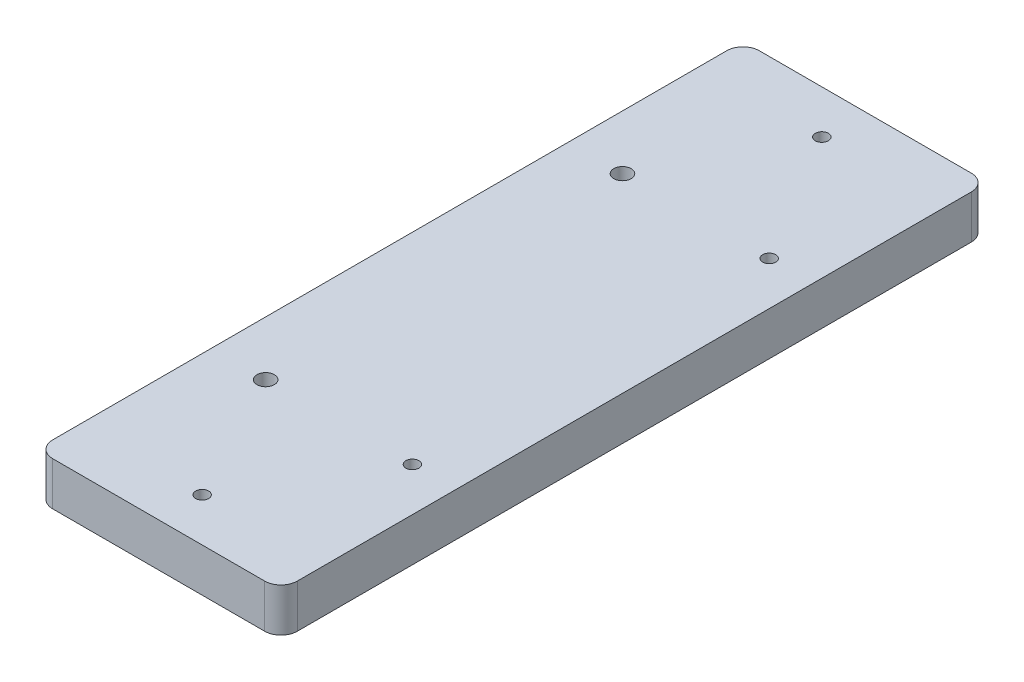
ISO-10303-21;
HEADER;
FILE_DESCRIPTION(('STEP AP214'),'2;1');
FILE_NAME('part.step','',(''),(''),'','','');
FILE_SCHEMA(('AUTOMOTIVE_DESIGN { 1 0 10303 214 1 1 1 1 }'));
ENDSEC;
DATA;
#1=APPLICATION_CONTEXT('core data for automotive mechanical design processes');
#2=APPLICATION_PROTOCOL_DEFINITION('international standard','automotive_design',2000,#1);
#3=PRODUCT_CONTEXT('',#1,'mechanical');
#4=PRODUCT('Part','Part','',(#3));
#5=PRODUCT_RELATED_PRODUCT_CATEGORY('part','',(#4));
#6=PRODUCT_DEFINITION_FORMATION('','',#4);
#7=PRODUCT_DEFINITION_CONTEXT('part definition',#1,'design');
#8=PRODUCT_DEFINITION('design','',#6,#7);
#9=PRODUCT_DEFINITION_SHAPE('','',#8);
#10=(LENGTH_UNIT() NAMED_UNIT(*) SI_UNIT(.MILLI.,.METRE.));
#11=(NAMED_UNIT(*) PLANE_ANGLE_UNIT() SI_UNIT($,.RADIAN.));
#12=(NAMED_UNIT(*) SI_UNIT($,.STERADIAN.) SOLID_ANGLE_UNIT());
#13=UNCERTAINTY_MEASURE_WITH_UNIT(LENGTH_MEASURE(1.E-05),#10,'distance_accuracy_value','');
#14=(GEOMETRIC_REPRESENTATION_CONTEXT(3) GLOBAL_UNCERTAINTY_ASSIGNED_CONTEXT((#13)) GLOBAL_UNIT_ASSIGNED_CONTEXT((#10,
#11,#12)) REPRESENTATION_CONTEXT('',''));
#15=CARTESIAN_POINT('',(0.,0.,0.));
#16=DIRECTION('',(0.,0.,1.));
#17=DIRECTION('',(1.,0.,0.));
#18=AXIS2_PLACEMENT_3D('',#15,#16,#17);
#19=CARTESIAN_POINT('',(0.,8.,0.));
#20=DIRECTION('',(0.,-1.,0.));
#21=DIRECTION('',(0.,0.,-1.));
#22=AXIS2_PLACEMENT_3D('',#19,#20,#21);
#23=PLANE('',#22);
#24=DIRECTION('',(-1.,0.,0.));
#25=VECTOR('',#24,1.);
#26=CARTESIAN_POINT('',(0.,8.,-130.));
#27=LINE('',#26,#25);
#28=CARTESIAN_POINT('',(42.,8.,-130.));
#29=VERTEX_POINT('',#28);
#30=CARTESIAN_POINT('',(3.,8.,-130.));
#31=VERTEX_POINT('',#30);
#32=EDGE_CURVE('E175',#29,#31,#27,.T.);
#33=ORIENTED_EDGE('',*,*,#32,.T.);
#34=CARTESIAN_POINT('',(3.,8.,-127.));
#35=DIRECTION('',(0.,-1.,0.));
#36=DIRECTION('',(0.,0.,-1.));
#37=AXIS2_PLACEMENT_3D('',#34,#35,#36);
#38=CIRCLE('',#37,3.);
#39=CARTESIAN_POINT('',(0.,8.,-127.));
#40=VERTEX_POINT('',#39);
#41=EDGE_CURVE('E152',#31,#40,#38,.F.);
#42=ORIENTED_EDGE('',*,*,#41,.T.);
#43=DIRECTION('',(0.,0.,1.));
#44=VECTOR('',#43,1.);
#45=CARTESIAN_POINT('',(0.,8.,0.));
#46=LINE('',#45,#44);
#47=CARTESIAN_POINT('',(0.,8.,-3.));
#48=VERTEX_POINT('',#47);
#49=EDGE_CURVE('E123',#40,#48,#46,.T.);
#50=ORIENTED_EDGE('',*,*,#49,.T.);
#51=CARTESIAN_POINT('',(3.,8.,-3.));
#52=DIRECTION('',(0.,-1.,0.));
#53=DIRECTION('',(0.,0.,-1.));
#54=AXIS2_PLACEMENT_3D('',#51,#52,#53);
#55=CIRCLE('',#54,3.);
#56=CARTESIAN_POINT('',(3.,8.,0.));
#57=VERTEX_POINT('',#56);
#58=EDGE_CURVE('E147',#48,#57,#55,.F.);
#59=ORIENTED_EDGE('',*,*,#58,.T.);
#60=DIRECTION('',(1.,0.,0.));
#61=VECTOR('',#60,1.);
#62=CARTESIAN_POINT('',(45.,8.,0.));
#63=LINE('',#62,#61);
#64=CARTESIAN_POINT('',(42.,8.,0.));
#65=VERTEX_POINT('',#64);
#66=EDGE_CURVE('E130',#57,#65,#63,.T.);
#67=ORIENTED_EDGE('',*,*,#66,.T.);
#68=CARTESIAN_POINT('',(42.,8.,-3.));
#69=DIRECTION('',(0.,-1.,0.));
#70=DIRECTION('',(0.,0.,-1.));
#71=AXIS2_PLACEMENT_3D('',#68,#69,#70);
#72=CIRCLE('',#71,3.);
#73=CARTESIAN_POINT('',(45.,8.,-3.));
#74=VERTEX_POINT('',#73);
#75=EDGE_CURVE('E59',#65,#74,#72,.F.);
#76=ORIENTED_EDGE('',*,*,#75,.T.);
#77=DIRECTION('',(0.,0.,-1.));
#78=VECTOR('',#77,1.);
#79=CARTESIAN_POINT('',(45.,8.,-130.));
#80=LINE('',#79,#78);
#81=CARTESIAN_POINT('',(45.,8.,-127.));
#82=VERTEX_POINT('',#81);
#83=EDGE_CURVE('E133',#74,#82,#80,.T.);
#84=ORIENTED_EDGE('',*,*,#83,.T.);
#85=CARTESIAN_POINT('',(42.,8.,-127.));
#86=DIRECTION('',(0.,-1.,0.));
#87=DIRECTION('',(0.,0.,-1.));
#88=AXIS2_PLACEMENT_3D('',#85,#86,#87);
#89=CIRCLE('',#88,3.);
#90=EDGE_CURVE('E150',#82,#29,#89,.F.);
#91=ORIENTED_EDGE('',*,*,#90,.T.);
#92=EDGE_LOOP('',(#33,#42,#50,#59,#67,#76,#84,#91));
#93=FACE_BOUND('',#92,.T.);
#94=CARTESIAN_POINT('',(10.,8.,-32.175));
#95=DIRECTION('',(0.,1.,0.));
#96=DIRECTION('',(0.,0.,1.));
#97=AXIS2_PLACEMENT_3D('',#94,#95,#96);
#98=CIRCLE('',#97,1.6);
#99=CARTESIAN_POINT('',(10.,8.,-30.575));
#100=VERTEX_POINT('',#99);
#101=EDGE_CURVE('E168',#100,#100,#98,.T.);
#102=ORIENTED_EDGE('',*,*,#101,.F.);
#103=EDGE_LOOP('',(#102));
#104=FACE_BOUND('',#103,.T.);
#105=CARTESIAN_POINT('',(10.,8.,-97.825));
#106=DIRECTION('',(0.,1.,0.));
#107=DIRECTION('',(0.,0.,1.));
#108=AXIS2_PLACEMENT_3D('',#105,#106,#107);
#109=CIRCLE('',#108,1.6);
#110=CARTESIAN_POINT('',(10.,8.,-96.225));
#111=VERTEX_POINT('',#110);
#112=EDGE_CURVE('E180',#111,#111,#109,.T.);
#113=ORIENTED_EDGE('',*,*,#112,.F.);
#114=EDGE_LOOP('',(#113));
#115=FACE_BOUND('',#114,.T.);
#116=CARTESIAN_POINT('',(22.5,8.,-8.));
#117=DIRECTION('',(0.,1.,0.));
#118=DIRECTION('',(0.,0.,1.));
#119=AXIS2_PLACEMENT_3D('',#116,#117,#118);
#120=CIRCLE('',#119,1.2);
#121=CARTESIAN_POINT('',(22.5,8.,-6.8));
#122=VERTEX_POINT('',#121);
#123=EDGE_CURVE('E185',#122,#122,#120,.T.);
#124=ORIENTED_EDGE('',*,*,#123,.F.);
#125=EDGE_LOOP('',(#124));
#126=FACE_BOUND('',#125,.T.);
#127=CARTESIAN_POINT('',(22.5,8.,-122.));
#128=DIRECTION('',(0.,1.,0.));
#129=DIRECTION('',(0.,0.,1.));
#130=AXIS2_PLACEMENT_3D('',#127,#128,#129);
#131=CIRCLE('',#130,1.20000000000001);
#132=CARTESIAN_POINT('',(22.5,8.,-120.8));
#133=VERTEX_POINT('',#132);
#134=EDGE_CURVE('E191',#133,#133,#131,.T.);
#135=ORIENTED_EDGE('',*,*,#134,.F.);
#136=EDGE_LOOP('',(#135));
#137=FACE_BOUND('',#136,.T.);
#138=CARTESIAN_POINT('',(37.,8.,-97.825));
#139=DIRECTION('',(0.,1.,0.));
#140=DIRECTION('',(0.,0.,1.));
#141=AXIS2_PLACEMENT_3D('',#138,#139,#140);
#142=CIRCLE('',#141,1.2);
#143=CARTESIAN_POINT('',(37.,8.,-96.625));
#144=VERTEX_POINT('',#143);
#145=EDGE_CURVE('E197',#144,#144,#142,.T.);
#146=ORIENTED_EDGE('',*,*,#145,.F.);
#147=EDGE_LOOP('',(#146));
#148=FACE_BOUND('',#147,.T.);
#149=CARTESIAN_POINT('',(37.,8.,-32.175));
#150=DIRECTION('',(0.,1.,0.));
#151=DIRECTION('',(0.,0.,1.));
#152=AXIS2_PLACEMENT_3D('',#149,#150,#151);
#153=CIRCLE('',#152,1.2);
#154=CARTESIAN_POINT('',(37.,8.,-30.975));
#155=VERTEX_POINT('',#154);
#156=EDGE_CURVE('E203',#155,#155,#153,.T.);
#157=ORIENTED_EDGE('',*,*,#156,.F.);
#158=EDGE_LOOP('',(#157));
#159=FACE_BOUND('',#158,.T.);
#160=ADVANCED_FACE('F37',(#93,#104,#115,#126,#137,#148,#159),#23,.F.);
#161=CARTESIAN_POINT('',(0.,0.,0.));
#162=DIRECTION('',(0.,-1.,0.));
#163=DIRECTION('',(0.,0.,-1.));
#164=AXIS2_PLACEMENT_3D('',#161,#162,#163);
#165=PLANE('',#164);
#166=CARTESIAN_POINT('',(37.,0.,-97.825));
#167=DIRECTION('',(0.,1.,0.));
#168=DIRECTION('',(0.,0.,1.));
#169=AXIS2_PLACEMENT_3D('',#166,#167,#168);
#170=CIRCLE('',#169,1.2);
#171=CARTESIAN_POINT('',(37.,0.,-96.625));
#172=VERTEX_POINT('',#171);
#173=EDGE_CURVE('E200',#172,#172,#170,.T.);
#174=ORIENTED_EDGE('',*,*,#173,.T.);
#175=EDGE_LOOP('',(#174));
#176=FACE_BOUND('',#175,.T.);
#177=CARTESIAN_POINT('',(22.5,0.,-8.));
#178=DIRECTION('',(0.,1.,0.));
#179=DIRECTION('',(0.,0.,1.));
#180=AXIS2_PLACEMENT_3D('',#177,#178,#179);
#181=CIRCLE('',#180,1.2);
#182=CARTESIAN_POINT('',(22.5,0.,-6.8));
#183=VERTEX_POINT('',#182);
#184=EDGE_CURVE('E188',#183,#183,#181,.T.);
#185=ORIENTED_EDGE('',*,*,#184,.T.);
#186=EDGE_LOOP('',(#185));
#187=FACE_BOUND('',#186,.T.);
#188=CARTESIAN_POINT('',(10.,0.,-32.175));
#189=DIRECTION('',(0.,1.,0.));
#190=DIRECTION('',(0.,0.,1.));
#191=AXIS2_PLACEMENT_3D('',#188,#189,#190);
#192=CIRCLE('',#191,1.6);
#193=CARTESIAN_POINT('',(10.,0.,-30.575));
#194=VERTEX_POINT('',#193);
#195=EDGE_CURVE('E171',#194,#194,#192,.T.);
#196=ORIENTED_EDGE('',*,*,#195,.T.);
#197=EDGE_LOOP('',(#196));
#198=FACE_BOUND('',#197,.T.);
#199=DIRECTION('',(0.,0.,1.));
#200=VECTOR('',#199,1.);
#201=CARTESIAN_POINT('',(0.,0.,0.));
#202=LINE('',#201,#200);
#203=CARTESIAN_POINT('',(0.,0.,-127.));
#204=VERTEX_POINT('',#203);
#205=CARTESIAN_POINT('',(0.,0.,-3.));
#206=VERTEX_POINT('',#205);
#207=EDGE_CURVE('E120',#204,#206,#202,.T.);
#208=ORIENTED_EDGE('',*,*,#207,.F.);
#209=CARTESIAN_POINT('',(3.,0.,-127.));
#210=DIRECTION('',(0.,-1.,0.));
#211=DIRECTION('',(0.,0.,-1.));
#212=AXIS2_PLACEMENT_3D('',#209,#210,#211);
#213=CIRCLE('',#212,3.);
#214=CARTESIAN_POINT('',(3.,0.,-130.));
#215=VERTEX_POINT('',#214);
#216=EDGE_CURVE('E103',#204,#215,#213,.T.);
#217=ORIENTED_EDGE('',*,*,#216,.T.);
#218=DIRECTION('',(-1.,0.,0.));
#219=VECTOR('',#218,1.);
#220=CARTESIAN_POINT('',(0.,0.,-130.));
#221=LINE('',#220,#219);
#222=CARTESIAN_POINT('',(42.,0.,-130.));
#223=VERTEX_POINT('',#222);
#224=EDGE_CURVE('E131',#223,#215,#221,.T.);
#225=ORIENTED_EDGE('',*,*,#224,.F.);
#226=CARTESIAN_POINT('',(42.,0.,-127.));
#227=DIRECTION('',(0.,-1.,0.));
#228=DIRECTION('',(0.,0.,-1.));
#229=AXIS2_PLACEMENT_3D('',#226,#227,#228);
#230=CIRCLE('',#229,3.);
#231=CARTESIAN_POINT('',(45.,0.,-127.));
#232=VERTEX_POINT('',#231);
#233=EDGE_CURVE('E114',#223,#232,#230,.T.);
#234=ORIENTED_EDGE('',*,*,#233,.T.);
#235=DIRECTION('',(0.,0.,-1.));
#236=VECTOR('',#235,1.);
#237=CARTESIAN_POINT('',(45.,0.,-130.));
#238=LINE('',#237,#236);
#239=CARTESIAN_POINT('',(45.,0.,-3.));
#240=VERTEX_POINT('',#239);
#241=EDGE_CURVE('E135',#240,#232,#238,.T.);
#242=ORIENTED_EDGE('',*,*,#241,.F.);
#243=CARTESIAN_POINT('',(42.,0.,-3.));
#244=DIRECTION('',(0.,-1.,0.));
#245=DIRECTION('',(0.,0.,-1.));
#246=AXIS2_PLACEMENT_3D('',#243,#244,#245);
#247=CIRCLE('',#246,3.);
#248=CARTESIAN_POINT('',(42.,0.,0.));
#249=VERTEX_POINT('',#248);
#250=EDGE_CURVE('E141',#240,#249,#247,.T.);
#251=ORIENTED_EDGE('',*,*,#250,.T.);
#252=DIRECTION('',(1.,0.,0.));
#253=VECTOR('',#252,1.);
#254=CARTESIAN_POINT('',(45.,0.,0.));
#255=LINE('',#254,#253);
#256=CARTESIAN_POINT('',(3.,0.,0.));
#257=VERTEX_POINT('',#256);
#258=EDGE_CURVE('E163',#257,#249,#255,.T.);
#259=ORIENTED_EDGE('',*,*,#258,.F.);
#260=CARTESIAN_POINT('',(3.,0.,-3.));
#261=DIRECTION('',(0.,-1.,0.));
#262=DIRECTION('',(0.,0.,-1.));
#263=AXIS2_PLACEMENT_3D('',#260,#261,#262);
#264=CIRCLE('',#263,3.);
#265=EDGE_CURVE('E124',#257,#206,#264,.T.);
#266=ORIENTED_EDGE('',*,*,#265,.T.);
#267=EDGE_LOOP('',(#208,#217,#225,#234,#242,#251,#259,#266));
#268=FACE_BOUND('',#267,.T.);
#269=CARTESIAN_POINT('',(10.,0.,-97.825));
#270=DIRECTION('',(0.,1.,0.));
#271=DIRECTION('',(0.,0.,1.));
#272=AXIS2_PLACEMENT_3D('',#269,#270,#271);
#273=CIRCLE('',#272,1.6);
#274=CARTESIAN_POINT('',(10.,0.,-96.225));
#275=VERTEX_POINT('',#274);
#276=EDGE_CURVE('E182',#275,#275,#273,.T.);
#277=ORIENTED_EDGE('',*,*,#276,.T.);
#278=EDGE_LOOP('',(#277));
#279=FACE_BOUND('',#278,.T.);
#280=CARTESIAN_POINT('',(22.5,0.,-122.));
#281=DIRECTION('',(0.,1.,0.));
#282=DIRECTION('',(0.,0.,1.));
#283=AXIS2_PLACEMENT_3D('',#280,#281,#282);
#284=CIRCLE('',#283,1.20000000000001);
#285=CARTESIAN_POINT('',(22.5,0.,-120.8));
#286=VERTEX_POINT('',#285);
#287=EDGE_CURVE('E194',#286,#286,#284,.T.);
#288=ORIENTED_EDGE('',*,*,#287,.T.);
#289=EDGE_LOOP('',(#288));
#290=FACE_BOUND('',#289,.T.);
#291=CARTESIAN_POINT('',(37.,0.,-32.175));
#292=DIRECTION('',(0.,1.,0.));
#293=DIRECTION('',(0.,0.,1.));
#294=AXIS2_PLACEMENT_3D('',#291,#292,#293);
#295=CIRCLE('',#294,1.2);
#296=CARTESIAN_POINT('',(37.,0.,-30.975));
#297=VERTEX_POINT('',#296);
#298=EDGE_CURVE('E206',#297,#297,#295,.T.);
#299=ORIENTED_EDGE('',*,*,#298,.T.);
#300=EDGE_LOOP('',(#299));
#301=FACE_BOUND('',#300,.T.);
#302=ADVANCED_FACE('F127',(#176,#187,#198,#268,#279,#290,#301),#165,.T.);
#303=CARTESIAN_POINT('',(45.,8.,0.));
#304=DIRECTION('',(0.,0.,-1.));
#305=DIRECTION('',(-1.,0.,0.));
#306=AXIS2_PLACEMENT_3D('',#303,#304,#305);
#307=PLANE('',#306);
#308=ORIENTED_EDGE('',*,*,#258,.T.);
#309=DIRECTION('',(0.,-1.,0.));
#310=VECTOR('',#309,1.);
#311=CARTESIAN_POINT('',(42.,8.,0.));
#312=LINE('',#311,#310);
#313=EDGE_CURVE('E11',#249,#65,#312,.F.);
#314=ORIENTED_EDGE('',*,*,#313,.T.);
#315=ORIENTED_EDGE('',*,*,#66,.F.);
#316=DIRECTION('',(0.,-1.,0.));
#317=VECTOR('',#316,1.);
#318=CARTESIAN_POINT('',(3.,8.,0.));
#319=LINE('',#318,#317);
#320=EDGE_CURVE('E45',#57,#257,#319,.T.);
#321=ORIENTED_EDGE('',*,*,#320,.T.);
#322=EDGE_LOOP('',(#308,#314,#315,#321));
#323=FACE_BOUND('',#322,.T.);
#324=ADVANCED_FACE('F162',(#323),#307,.F.);
#325=CARTESIAN_POINT('',(45.,8.,-130.));
#326=DIRECTION('',(-1.,0.,0.));
#327=DIRECTION('',(0.,0.,1.));
#328=AXIS2_PLACEMENT_3D('',#325,#326,#327);
#329=PLANE('',#328);
#330=ORIENTED_EDGE('',*,*,#241,.T.);
#331=DIRECTION('',(0.,-1.,0.));
#332=VECTOR('',#331,1.);
#333=CARTESIAN_POINT('',(45.,8.,-127.));
#334=LINE('',#333,#332);
#335=EDGE_CURVE('E52',#232,#82,#334,.F.);
#336=ORIENTED_EDGE('',*,*,#335,.T.);
#337=ORIENTED_EDGE('',*,*,#83,.F.);
#338=DIRECTION('',(0.,-1.,0.));
#339=VECTOR('',#338,1.);
#340=CARTESIAN_POINT('',(45.,8.,-3.));
#341=LINE('',#340,#339);
#342=EDGE_CURVE('E154',#74,#240,#341,.T.);
#343=ORIENTED_EDGE('',*,*,#342,.T.);
#344=EDGE_LOOP('',(#330,#336,#337,#343));
#345=FACE_BOUND('',#344,.T.);
#346=ADVANCED_FACE('F232',(#345),#329,.F.);
#347=CARTESIAN_POINT('',(0.,8.,-130.));
#348=DIRECTION('',(0.,0.,1.));
#349=DIRECTION('',(1.,0.,0.));
#350=AXIS2_PLACEMENT_3D('',#347,#348,#349);
#351=PLANE('',#350);
#352=ORIENTED_EDGE('',*,*,#224,.T.);
#353=DIRECTION('',(0.,-1.,0.));
#354=VECTOR('',#353,1.);
#355=CARTESIAN_POINT('',(3.,8.,-130.));
#356=LINE('',#355,#354);
#357=EDGE_CURVE('E108',#215,#31,#356,.F.);
#358=ORIENTED_EDGE('',*,*,#357,.T.);
#359=ORIENTED_EDGE('',*,*,#32,.F.);
#360=DIRECTION('',(0.,-1.,0.));
#361=VECTOR('',#360,1.);
#362=CARTESIAN_POINT('',(42.,8.,-130.));
#363=LINE('',#362,#361);
#364=EDGE_CURVE('E113',#29,#223,#363,.T.);
#365=ORIENTED_EDGE('',*,*,#364,.T.);
#366=EDGE_LOOP('',(#352,#358,#359,#365));
#367=FACE_BOUND('',#366,.T.);
#368=ADVANCED_FACE('F229',(#367),#351,.F.);
#369=CARTESIAN_POINT('',(0.,8.,0.));
#370=DIRECTION('',(1.,0.,0.));
#371=DIRECTION('',(0.,0.,-1.));
#372=AXIS2_PLACEMENT_3D('',#369,#370,#371);
#373=PLANE('',#372);
#374=ORIENTED_EDGE('',*,*,#49,.F.);
#375=DIRECTION('',(0.,-1.,0.));
#376=VECTOR('',#375,1.);
#377=CARTESIAN_POINT('',(0.,8.,-127.));
#378=LINE('',#377,#376);
#379=EDGE_CURVE('E107',#40,#204,#378,.T.);
#380=ORIENTED_EDGE('',*,*,#379,.T.);
#381=ORIENTED_EDGE('',*,*,#207,.T.);
#382=DIRECTION('',(0.,-1.,0.));
#383=VECTOR('',#382,1.);
#384=CARTESIAN_POINT('',(0.,8.,-3.));
#385=LINE('',#384,#383);
#386=EDGE_CURVE('E125',#206,#48,#385,.F.);
#387=ORIENTED_EDGE('',*,*,#386,.T.);
#388=EDGE_LOOP('',(#374,#380,#381,#387));
#389=FACE_BOUND('',#388,.T.);
#390=ADVANCED_FACE('F119',(#389),#373,.F.);
#391=CARTESIAN_POINT('',(10.,8.,-32.175));
#392=DIRECTION('',(0.,-1.,0.));
#393=DIRECTION('',(0.,0.,-1.));
#394=AXIS2_PLACEMENT_3D('',#391,#392,#393);
#395=CYLINDRICAL_SURFACE('',#394,1.6);
#396=ORIENTED_EDGE('',*,*,#101,.T.);
#397=EDGE_LOOP('',(#396));
#398=FACE_BOUND('',#397,.T.);
#399=ORIENTED_EDGE('',*,*,#195,.F.);
#400=EDGE_LOOP('',(#399));
#401=FACE_BOUND('',#400,.T.);
#402=ADVANCED_FACE('F224',(#398,#401),#395,.F.);
#403=CARTESIAN_POINT('',(10.,8.,-97.825));
#404=DIRECTION('',(0.,-1.,0.));
#405=DIRECTION('',(0.,0.,-1.));
#406=AXIS2_PLACEMENT_3D('',#403,#404,#405);
#407=CYLINDRICAL_SURFACE('',#406,1.6);
#408=ORIENTED_EDGE('',*,*,#112,.T.);
#409=EDGE_LOOP('',(#408));
#410=FACE_BOUND('',#409,.T.);
#411=ORIENTED_EDGE('',*,*,#276,.F.);
#412=EDGE_LOOP('',(#411));
#413=FACE_BOUND('',#412,.T.);
#414=ADVANCED_FACE('F345',(#410,#413),#407,.F.);
#415=CARTESIAN_POINT('',(22.5,8.,-8.));
#416=DIRECTION('',(0.,-1.,0.));
#417=DIRECTION('',(0.,0.,-1.));
#418=AXIS2_PLACEMENT_3D('',#415,#416,#417);
#419=CYLINDRICAL_SURFACE('',#418,1.2);
#420=ORIENTED_EDGE('',*,*,#123,.T.);
#421=EDGE_LOOP('',(#420));
#422=FACE_BOUND('',#421,.T.);
#423=ORIENTED_EDGE('',*,*,#184,.F.);
#424=EDGE_LOOP('',(#423));
#425=FACE_BOUND('',#424,.T.);
#426=ADVANCED_FACE('F335',(#422,#425),#419,.F.);
#427=CARTESIAN_POINT('',(22.5,8.,-122.));
#428=DIRECTION('',(0.,-1.,0.));
#429=DIRECTION('',(0.,0.,-1.));
#430=AXIS2_PLACEMENT_3D('',#427,#428,#429);
#431=CYLINDRICAL_SURFACE('',#430,1.20000000000001);
#432=ORIENTED_EDGE('',*,*,#134,.T.);
#433=EDGE_LOOP('',(#432));
#434=FACE_BOUND('',#433,.T.);
#435=ORIENTED_EDGE('',*,*,#287,.F.);
#436=EDGE_LOOP('',(#435));
#437=FACE_BOUND('',#436,.T.);
#438=ADVANCED_FACE('F325',(#434,#437),#431,.F.);
#439=CARTESIAN_POINT('',(37.,8.,-97.825));
#440=DIRECTION('',(0.,-1.,0.));
#441=DIRECTION('',(0.,0.,-1.));
#442=AXIS2_PLACEMENT_3D('',#439,#440,#441);
#443=CYLINDRICAL_SURFACE('',#442,1.2);
#444=ORIENTED_EDGE('',*,*,#145,.T.);
#445=EDGE_LOOP('',(#444));
#446=FACE_BOUND('',#445,.T.);
#447=ORIENTED_EDGE('',*,*,#173,.F.);
#448=EDGE_LOOP('',(#447));
#449=FACE_BOUND('',#448,.T.);
#450=ADVANCED_FACE('F316',(#446,#449),#443,.F.);
#451=CARTESIAN_POINT('',(37.,8.,-32.175));
#452=DIRECTION('',(0.,-1.,0.));
#453=DIRECTION('',(0.,0.,-1.));
#454=AXIS2_PLACEMENT_3D('',#451,#452,#453);
#455=CYLINDRICAL_SURFACE('',#454,1.2);
#456=ORIENTED_EDGE('',*,*,#156,.T.);
#457=EDGE_LOOP('',(#456));
#458=FACE_BOUND('',#457,.T.);
#459=ORIENTED_EDGE('',*,*,#298,.F.);
#460=EDGE_LOOP('',(#459));
#461=FACE_BOUND('',#460,.T.);
#462=ADVANCED_FACE('F212',(#458,#461),#455,.F.);
#463=CARTESIAN_POINT('',(3.,8.,-127.));
#464=DIRECTION('',(0.,-1.,0.));
#465=DIRECTION('',(0.,0.,-1.));
#466=AXIS2_PLACEMENT_3D('',#463,#464,#465);
#467=CYLINDRICAL_SURFACE('',#466,3.);
#468=ORIENTED_EDGE('',*,*,#41,.F.);
#469=ORIENTED_EDGE('',*,*,#357,.F.);
#470=ORIENTED_EDGE('',*,*,#216,.F.);
#471=ORIENTED_EDGE('',*,*,#379,.F.);
#472=EDGE_LOOP('',(#468,#469,#470,#471));
#473=FACE_BOUND('',#472,.T.);
#474=ADVANCED_FACE('F106',(#473),#467,.T.);
#475=CARTESIAN_POINT('',(42.,8.,-127.));
#476=DIRECTION('',(0.,-1.,0.));
#477=DIRECTION('',(0.,0.,-1.));
#478=AXIS2_PLACEMENT_3D('',#475,#476,#477);
#479=CYLINDRICAL_SURFACE('',#478,3.);
#480=ORIENTED_EDGE('',*,*,#90,.F.);
#481=ORIENTED_EDGE('',*,*,#335,.F.);
#482=ORIENTED_EDGE('',*,*,#233,.F.);
#483=ORIENTED_EDGE('',*,*,#364,.F.);
#484=EDGE_LOOP('',(#480,#481,#482,#483));
#485=FACE_BOUND('',#484,.T.);
#486=ADVANCED_FACE('F240',(#485),#479,.T.);
#487=CARTESIAN_POINT('',(42.,8.,-3.));
#488=DIRECTION('',(0.,-1.,0.));
#489=DIRECTION('',(0.,0.,-1.));
#490=AXIS2_PLACEMENT_3D('',#487,#488,#489);
#491=CYLINDRICAL_SURFACE('',#490,3.);
#492=ORIENTED_EDGE('',*,*,#75,.F.);
#493=ORIENTED_EDGE('',*,*,#313,.F.);
#494=ORIENTED_EDGE('',*,*,#250,.F.);
#495=ORIENTED_EDGE('',*,*,#342,.F.);
#496=EDGE_LOOP('',(#492,#493,#494,#495));
#497=FACE_BOUND('',#496,.T.);
#498=ADVANCED_FACE('F242',(#497),#491,.T.);
#499=CARTESIAN_POINT('',(3.,8.,-3.));
#500=DIRECTION('',(0.,-1.,0.));
#501=DIRECTION('',(0.,0.,-1.));
#502=AXIS2_PLACEMENT_3D('',#499,#500,#501);
#503=CYLINDRICAL_SURFACE('',#502,3.);
#504=ORIENTED_EDGE('',*,*,#58,.F.);
#505=ORIENTED_EDGE('',*,*,#386,.F.);
#506=ORIENTED_EDGE('',*,*,#265,.F.);
#507=ORIENTED_EDGE('',*,*,#320,.F.);
#508=EDGE_LOOP('',(#504,#505,#506,#507));
#509=FACE_BOUND('',#508,.T.);
#510=ADVANCED_FACE('F39',(#509),#503,.T.);
#511=CLOSED_SHELL('',(#160,#302,#324,#346,#368,#390,#402,#414,#426,#438,#450,#462,#474,#486,
#498,#510));
#512=MANIFOLD_SOLID_BREP('B2',#511);
#513=ADVANCED_BREP_SHAPE_REPRESENTATION('',(#18,#512),#14);
#514=SHAPE_DEFINITION_REPRESENTATION(#9,#513);
ENDSEC;
END-ISO-10303-21;
